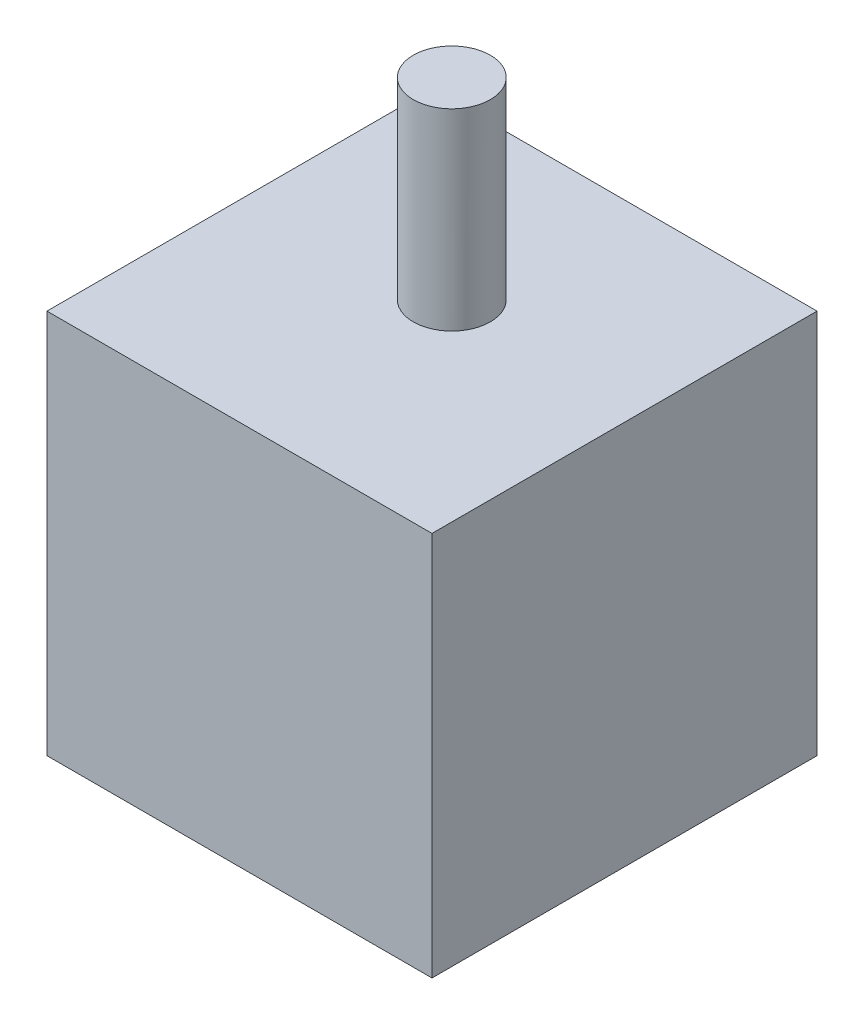
ISO-10303-21;
HEADER;
FILE_DESCRIPTION(('STEP AP214'),'2;1');
FILE_NAME('part.step','',(''),(''),'','','');
FILE_SCHEMA(('AUTOMOTIVE_DESIGN { 1 0 10303 214 1 1 1 1 }'));
ENDSEC;
DATA;
#1=APPLICATION_CONTEXT('core data for automotive mechanical design processes');
#2=APPLICATION_PROTOCOL_DEFINITION('international standard','automotive_design',2000,#1);
#3=PRODUCT_CONTEXT('',#1,'mechanical');
#4=PRODUCT('Part','Part','',(#3));
#5=PRODUCT_RELATED_PRODUCT_CATEGORY('part','',(#4));
#6=PRODUCT_DEFINITION_FORMATION('','',#4);
#7=PRODUCT_DEFINITION_CONTEXT('part definition',#1,'design');
#8=PRODUCT_DEFINITION('design','',#6,#7);
#9=PRODUCT_DEFINITION_SHAPE('','',#8);
#10=(LENGTH_UNIT() NAMED_UNIT(*) SI_UNIT(.MILLI.,.METRE.));
#11=(NAMED_UNIT(*) PLANE_ANGLE_UNIT() SI_UNIT($,.RADIAN.));
#12=(NAMED_UNIT(*) SI_UNIT($,.STERADIAN.) SOLID_ANGLE_UNIT());
#13=UNCERTAINTY_MEASURE_WITH_UNIT(LENGTH_MEASURE(1.E-05),#10,'distance_accuracy_value','');
#14=(GEOMETRIC_REPRESENTATION_CONTEXT(3) GLOBAL_UNCERTAINTY_ASSIGNED_CONTEXT((#13)) GLOBAL_UNIT_ASSIGNED_CONTEXT((#10,
#11,#12)) REPRESENTATION_CONTEXT('',''));
#15=CARTESIAN_POINT('',(0.,0.,0.));
#16=DIRECTION('',(0.,0.,1.));
#17=DIRECTION('',(1.,0.,0.));
#18=AXIS2_PLACEMENT_3D('',#15,#16,#17);
#19=CARTESIAN_POINT('',(-13.5150561278013,6.23466247929428,20.));
#20=DIRECTION('',(1.,0.,0.));
#21=DIRECTION('',(0.,1.,0.));
#22=AXIS2_PLACEMENT_3D('',#19,#20,#21);
#23=PLANE('',#22);
#24=DIRECTION('',(0.,-1.,0.));
#25=VECTOR('',#24,1.);
#26=CARTESIAN_POINT('',(-13.5150561278013,6.23466247929428,0.));
#27=LINE('',#26,#25);
#28=CARTESIAN_POINT('',(-13.5150561278013,6.23466247929428,0.));
#29=VERTEX_POINT('',#28);
#30=CARTESIAN_POINT('',(-13.5150561278013,-13.7653375207057,0.));
#31=VERTEX_POINT('',#30);
#32=EDGE_CURVE('E99',#29,#31,#27,.T.);
#33=ORIENTED_EDGE('',*,*,#32,.T.);
#34=DIRECTION('',(0.,0.,-1.));
#35=VECTOR('',#34,1.);
#36=CARTESIAN_POINT('',(-13.5150561278013,-13.7653375207057,20.));
#37=LINE('',#36,#35);
#38=CARTESIAN_POINT('',(-13.5150561278013,-13.7653375207057,20.));
#39=VERTEX_POINT('',#38);
#40=EDGE_CURVE('E41',#39,#31,#37,.T.);
#41=ORIENTED_EDGE('',*,*,#40,.F.);
#42=DIRECTION('',(0.,-1.,0.));
#43=VECTOR('',#42,1.);
#44=CARTESIAN_POINT('',(-13.5150561278013,6.23466247929428,20.));
#45=LINE('',#44,#43);
#46=CARTESIAN_POINT('',(-13.5150561278013,6.23466247929428,20.));
#47=VERTEX_POINT('',#46);
#48=EDGE_CURVE('E85',#47,#39,#45,.T.);
#49=ORIENTED_EDGE('',*,*,#48,.F.);
#50=DIRECTION('',(0.,0.,-1.));
#51=VECTOR('',#50,1.);
#52=CARTESIAN_POINT('',(-13.5150561278013,6.23466247929428,20.));
#53=LINE('',#52,#51);
#54=EDGE_CURVE('E95',#47,#29,#53,.T.);
#55=ORIENTED_EDGE('',*,*,#54,.T.);
#56=EDGE_LOOP('',(#33,#41,#49,#55));
#57=FACE_BOUND('',#56,.T.);
#58=ADVANCED_FACE('F33',(#57),#23,.F.);
#59=CARTESIAN_POINT('',(-13.5150561278013,-13.7653375207057,20.));
#60=DIRECTION('',(0.,1.,0.));
#61=DIRECTION('',(0.,0.,1.));
#62=AXIS2_PLACEMENT_3D('',#59,#60,#61);
#63=PLANE('',#62);
#64=DIRECTION('',(1.,0.,0.));
#65=VECTOR('',#64,1.);
#66=CARTESIAN_POINT('',(-13.5150561278013,-13.7653375207057,0.));
#67=LINE('',#66,#65);
#68=CARTESIAN_POINT('',(6.48494387219869,-13.7653375207057,0.));
#69=VERTEX_POINT('',#68);
#70=EDGE_CURVE('E90',#31,#69,#67,.T.);
#71=ORIENTED_EDGE('',*,*,#70,.T.);
#72=DIRECTION('',(0.,0.,-1.));
#73=VECTOR('',#72,1.);
#74=CARTESIAN_POINT('',(6.48494387219869,-13.7653375207057,20.));
#75=LINE('',#74,#73);
#76=CARTESIAN_POINT('',(6.48494387219869,-13.7653375207057,20.));
#77=VERTEX_POINT('',#76);
#78=EDGE_CURVE('E88',#77,#69,#75,.T.);
#79=ORIENTED_EDGE('',*,*,#78,.F.);
#80=DIRECTION('',(1.,0.,0.));
#81=VECTOR('',#80,1.);
#82=CARTESIAN_POINT('',(-13.5150561278013,-13.7653375207057,20.));
#83=LINE('',#82,#81);
#84=EDGE_CURVE('E80',#39,#77,#83,.T.);
#85=ORIENTED_EDGE('',*,*,#84,.F.);
#86=ORIENTED_EDGE('',*,*,#40,.T.);
#87=EDGE_LOOP('',(#71,#79,#85,#86));
#88=FACE_BOUND('',#87,.T.);
#89=ADVANCED_FACE('F89',(#88),#63,.F.);
#90=CARTESIAN_POINT('',(6.48494387219869,6.23466247929428,20.));
#91=DIRECTION('',(-1.,0.,0.));
#92=DIRECTION('',(0.,0.,1.));
#93=AXIS2_PLACEMENT_3D('',#90,#91,#92);
#94=PLANE('',#93);
#95=DIRECTION('',(0.,1.,0.));
#96=VECTOR('',#95,1.);
#97=CARTESIAN_POINT('',(6.48494387219869,6.23466247929428,0.));
#98=LINE('',#97,#96);
#99=CARTESIAN_POINT('',(6.48494387219869,6.23466247929428,0.));
#100=VERTEX_POINT('',#99);
#101=EDGE_CURVE('E66',#69,#100,#98,.T.);
#102=ORIENTED_EDGE('',*,*,#101,.T.);
#103=DIRECTION('',(0.,0.,-1.));
#104=VECTOR('',#103,1.);
#105=CARTESIAN_POINT('',(6.48494387219869,6.23466247929428,20.));
#106=LINE('',#105,#104);
#107=CARTESIAN_POINT('',(6.48494387219869,6.23466247929428,20.));
#108=VERTEX_POINT('',#107);
#109=EDGE_CURVE('E91',#108,#100,#106,.T.);
#110=ORIENTED_EDGE('',*,*,#109,.F.);
#111=DIRECTION('',(0.,1.,0.));
#112=VECTOR('',#111,1.);
#113=CARTESIAN_POINT('',(6.48494387219869,6.23466247929428,20.));
#114=LINE('',#113,#112);
#115=EDGE_CURVE('E83',#77,#108,#114,.T.);
#116=ORIENTED_EDGE('',*,*,#115,.F.);
#117=ORIENTED_EDGE('',*,*,#78,.T.);
#118=EDGE_LOOP('',(#102,#110,#116,#117));
#119=FACE_BOUND('',#118,.T.);
#120=ADVANCED_FACE('F93',(#119),#94,.F.);
#121=CARTESIAN_POINT('',(-13.5150561278013,6.23466247929428,20.));
#122=DIRECTION('',(0.,-1.,0.));
#123=DIRECTION('',(0.,0.,-1.));
#124=AXIS2_PLACEMENT_3D('',#121,#122,#123);
#125=PLANE('',#124);
#126=CARTESIAN_POINT('',(-3.51505612780131,6.23466247929428,8.97189752777194));
#127=DIRECTION('',(0.,-1.,0.));
#128=DIRECTION('',(0.,0.,-1.));
#129=AXIS2_PLACEMENT_3D('',#126,#127,#128);
#130=CIRCLE('',#129,2.);
#131=CARTESIAN_POINT('',(-3.51505612780131,6.23466247929428,6.97189752777194));
#132=VERTEX_POINT('',#131);
#133=EDGE_CURVE('E11',#132,#132,#130,.F.);
#134=ORIENTED_EDGE('',*,*,#133,.F.);
#135=EDGE_LOOP('',(#134));
#136=FACE_BOUND('',#135,.T.);
#137=DIRECTION('',(-1.,0.,0.));
#138=VECTOR('',#137,1.);
#139=CARTESIAN_POINT('',(-13.5150561278013,6.23466247929428,0.));
#140=LINE('',#139,#138);
#141=EDGE_CURVE('E72',#100,#29,#140,.T.);
#142=ORIENTED_EDGE('',*,*,#141,.T.);
#143=ORIENTED_EDGE('',*,*,#54,.F.);
#144=DIRECTION('',(-1.,0.,0.));
#145=VECTOR('',#144,1.);
#146=CARTESIAN_POINT('',(-13.5150561278013,6.23466247929428,20.));
#147=LINE('',#146,#145);
#148=EDGE_CURVE('E49',#108,#47,#147,.T.);
#149=ORIENTED_EDGE('',*,*,#148,.F.);
#150=ORIENTED_EDGE('',*,*,#109,.T.);
#151=EDGE_LOOP('',(#142,#143,#149,#150));
#152=FACE_BOUND('',#151,.T.);
#153=ADVANCED_FACE('F121',(#136,#152),#125,.F.);
#154=CARTESIAN_POINT('',(0.,0.,20.));
#155=DIRECTION('',(0.,0.,1.));
#156=DIRECTION('',(1.,0.,0.));
#157=AXIS2_PLACEMENT_3D('',#154,#155,#156);
#158=PLANE('',#157);
#159=ORIENTED_EDGE('',*,*,#48,.T.);
#160=ORIENTED_EDGE('',*,*,#84,.T.);
#161=ORIENTED_EDGE('',*,*,#115,.T.);
#162=ORIENTED_EDGE('',*,*,#148,.T.);
#163=EDGE_LOOP('',(#159,#160,#161,#162));
#164=FACE_BOUND('',#163,.T.);
#165=ADVANCED_FACE('F81',(#164),#158,.T.);
#166=CARTESIAN_POINT('',(0.,0.,0.));
#167=DIRECTION('',(0.,0.,1.));
#168=DIRECTION('',(1.,0.,0.));
#169=AXIS2_PLACEMENT_3D('',#166,#167,#168);
#170=PLANE('',#169);
#171=ORIENTED_EDGE('',*,*,#32,.F.);
#172=ORIENTED_EDGE('',*,*,#141,.F.);
#173=ORIENTED_EDGE('',*,*,#101,.F.);
#174=ORIENTED_EDGE('',*,*,#70,.F.);
#175=EDGE_LOOP('',(#171,#172,#173,#174));
#176=FACE_BOUND('',#175,.T.);
#177=ADVANCED_FACE('F110',(#176),#170,.F.);
#178=CARTESIAN_POINT('',(-3.51505612780131,16.2346624792943,8.97189752777194));
#179=DIRECTION('',(0.,-1.,0.));
#180=DIRECTION('',(0.,0.,-1.));
#181=AXIS2_PLACEMENT_3D('',#178,#179,#180);
#182=CYLINDRICAL_SURFACE('',#181,2.);
#183=CARTESIAN_POINT('',(-3.51505612780131,16.2346624792943,8.97189752777194));
#184=DIRECTION('',(0.,1.,0.));
#185=DIRECTION('',(0.,0.,1.));
#186=AXIS2_PLACEMENT_3D('',#183,#184,#185);
#187=CIRCLE('',#186,2.);
#188=CARTESIAN_POINT('',(-3.51505612780131,16.2346624792943,10.9718975277719));
#189=VERTEX_POINT('',#188);
#190=EDGE_CURVE('E102',#189,#189,#187,.T.);
#191=ORIENTED_EDGE('',*,*,#190,.F.);
#192=EDGE_LOOP('',(#191));
#193=FACE_BOUND('',#192,.T.);
#194=ORIENTED_EDGE('',*,*,#133,.T.);
#195=EDGE_LOOP('',(#194));
#196=FACE_BOUND('',#195,.T.);
#197=ADVANCED_FACE('F112',(#193,#196),#182,.T.);
#198=CARTESIAN_POINT('',(-3.51505612780131,16.2346624792943,8.97189752777194));
#199=DIRECTION('',(0.,1.,0.));
#200=DIRECTION('',(0.,0.,1.));
#201=AXIS2_PLACEMENT_3D('',#198,#199,#200);
#202=PLANE('',#201);
#203=ORIENTED_EDGE('',*,*,#190,.T.);
#204=EDGE_LOOP('',(#203));
#205=FACE_BOUND('',#204,.T.);
#206=ADVANCED_FACE('F118',(#205),#202,.T.);
#207=CLOSED_SHELL('',(#58,#89,#120,#153,#165,#177,#197,#206));
#208=MANIFOLD_SOLID_BREP('B2',#207);
#209=ADVANCED_BREP_SHAPE_REPRESENTATION('',(#18,#208),#14);
#210=SHAPE_DEFINITION_REPRESENTATION(#9,#209);
ENDSEC;
END-ISO-10303-21;
